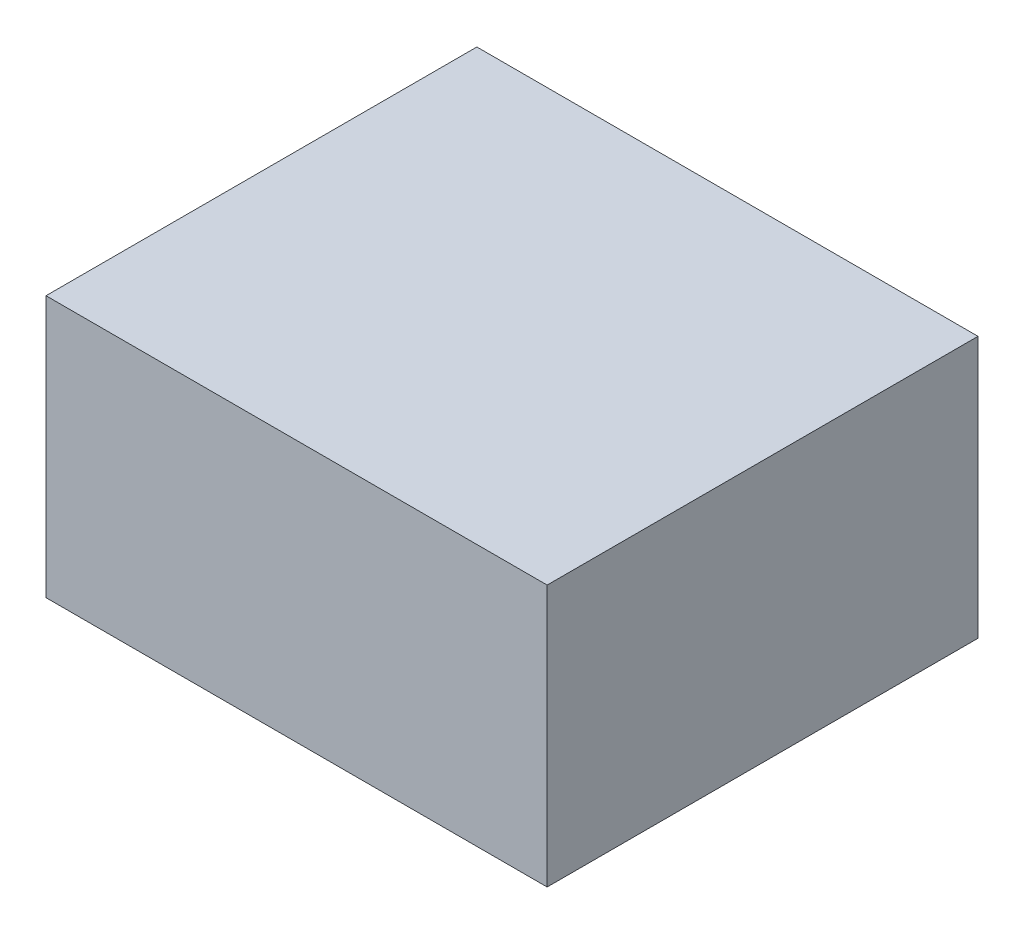
ISO-10303-21;
HEADER;
FILE_DESCRIPTION(('STEP AP214'),'2;1');
FILE_NAME('part.step','',(''),(''),'','','');
FILE_SCHEMA(('AUTOMOTIVE_DESIGN { 1 0 10303 214 1 1 1 1 }'));
ENDSEC;
DATA;
#1=APPLICATION_CONTEXT('core data for automotive mechanical design processes');
#2=APPLICATION_PROTOCOL_DEFINITION('international standard','automotive_design',2000,#1);
#3=PRODUCT_CONTEXT('',#1,'mechanical');
#4=PRODUCT('Part','Part','',(#3));
#5=PRODUCT_RELATED_PRODUCT_CATEGORY('part','',(#4));
#6=PRODUCT_DEFINITION_FORMATION('','',#4);
#7=PRODUCT_DEFINITION_CONTEXT('part definition',#1,'design');
#8=PRODUCT_DEFINITION('design','',#6,#7);
#9=PRODUCT_DEFINITION_SHAPE('','',#8);
#10=(LENGTH_UNIT() NAMED_UNIT(*) SI_UNIT(.MILLI.,.METRE.));
#11=(NAMED_UNIT(*) PLANE_ANGLE_UNIT() SI_UNIT($,.RADIAN.));
#12=(NAMED_UNIT(*) SI_UNIT($,.STERADIAN.) SOLID_ANGLE_UNIT());
#13=UNCERTAINTY_MEASURE_WITH_UNIT(LENGTH_MEASURE(1.E-05),#10,'distance_accuracy_value','');
#14=(GEOMETRIC_REPRESENTATION_CONTEXT(3) GLOBAL_UNCERTAINTY_ASSIGNED_CONTEXT((#13)) GLOBAL_UNIT_ASSIGNED_CONTEXT((#10,
#11,#12)) REPRESENTATION_CONTEXT('',''));
#15=CARTESIAN_POINT('',(0.,0.,0.));
#16=DIRECTION('',(0.,0.,1.));
#17=DIRECTION('',(1.,0.,0.));
#18=AXIS2_PLACEMENT_3D('',#15,#16,#17);
#19=CARTESIAN_POINT('',(12.2428,3.48000320000001,12.010009));
#20=DIRECTION('',(-1.,0.,0.));
#21=DIRECTION('',(0.,0.,1.));
#22=AXIS2_PLACEMENT_3D('',#19,#20,#21);
#23=PLANE('',#22);
#24=DIRECTION('',(0.,1.,0.));
#25=VECTOR('',#24,1.);
#26=CARTESIAN_POINT('',(12.2428,3.48000320000001,0.));
#27=LINE('',#26,#25);
#28=CARTESIAN_POINT('',(12.2428,-3.81,0.));
#29=VERTEX_POINT('',#28);
#30=CARTESIAN_POINT('',(12.2428,3.48000320000001,0.));
#31=VERTEX_POINT('',#30);
#32=EDGE_CURVE('E95',#29,#31,#27,.T.);
#33=ORIENTED_EDGE('',*,*,#32,.T.);
#34=DIRECTION('',(0.,0.,-1.));
#35=VECTOR('',#34,1.);
#36=CARTESIAN_POINT('',(12.2428,3.48000320000001,12.010009));
#37=LINE('',#36,#35);
#38=CARTESIAN_POINT('',(12.2428,3.48000320000001,12.010009));
#39=VERTEX_POINT('',#38);
#40=EDGE_CURVE('E11',#39,#31,#37,.T.);
#41=ORIENTED_EDGE('',*,*,#40,.F.);
#42=DIRECTION('',(0.,1.,0.));
#43=VECTOR('',#42,1.);
#44=CARTESIAN_POINT('',(12.2428,3.48000320000001,12.010009));
#45=LINE('',#44,#43);
#46=CARTESIAN_POINT('',(12.2428,-3.81,12.010009));
#47=VERTEX_POINT('',#46);
#48=EDGE_CURVE('E83',#47,#39,#45,.T.);
#49=ORIENTED_EDGE('',*,*,#48,.F.);
#50=DIRECTION('',(0.,0.,-1.));
#51=VECTOR('',#50,1.);
#52=CARTESIAN_POINT('',(12.2428,-3.81,12.010009));
#53=LINE('',#52,#51);
#54=EDGE_CURVE('E91',#47,#29,#53,.T.);
#55=ORIENTED_EDGE('',*,*,#54,.T.);
#56=EDGE_LOOP('',(#33,#41,#49,#55));
#57=FACE_BOUND('',#56,.T.);
#58=ADVANCED_FACE('F32',(#57),#23,.F.);
#59=CARTESIAN_POINT('',(-1.7272,3.48000320000001,12.010009));
#60=DIRECTION('',(0.,-1.,0.));
#61=DIRECTION('',(0.,0.,-1.));
#62=AXIS2_PLACEMENT_3D('',#59,#60,#61);
#63=PLANE('',#62);
#64=DIRECTION('',(-1.,0.,0.));
#65=VECTOR('',#64,1.);
#66=CARTESIAN_POINT('',(-1.7272,3.48000320000001,0.));
#67=LINE('',#66,#65);
#68=CARTESIAN_POINT('',(-1.7272,3.48000320000001,0.));
#69=VERTEX_POINT('',#68);
#70=EDGE_CURVE('E87',#31,#69,#67,.T.);
#71=ORIENTED_EDGE('',*,*,#70,.T.);
#72=DIRECTION('',(0.,0.,-1.));
#73=VECTOR('',#72,1.);
#74=CARTESIAN_POINT('',(-1.7272,3.48000320000001,12.010009));
#75=LINE('',#74,#73);
#76=CARTESIAN_POINT('',(-1.7272,3.48000320000001,12.010009));
#77=VERTEX_POINT('',#76);
#78=EDGE_CURVE('E40',#77,#69,#75,.T.);
#79=ORIENTED_EDGE('',*,*,#78,.F.);
#80=DIRECTION('',(-1.,0.,0.));
#81=VECTOR('',#80,1.);
#82=CARTESIAN_POINT('',(-1.7272,3.48000320000001,12.010009));
#83=LINE('',#82,#81);
#84=EDGE_CURVE('E78',#39,#77,#83,.T.);
#85=ORIENTED_EDGE('',*,*,#84,.F.);
#86=ORIENTED_EDGE('',*,*,#40,.T.);
#87=EDGE_LOOP('',(#71,#79,#85,#86));
#88=FACE_BOUND('',#87,.T.);
#89=ADVANCED_FACE('F86',(#88),#63,.F.);
#90=CARTESIAN_POINT('',(-1.7272,-3.81,12.010009));
#91=DIRECTION('',(1.,0.,0.));
#92=DIRECTION('',(0.,0.,-1.));
#93=AXIS2_PLACEMENT_3D('',#90,#91,#92);
#94=PLANE('',#93);
#95=DIRECTION('',(0.,-1.,0.));
#96=VECTOR('',#95,1.);
#97=CARTESIAN_POINT('',(-1.7272,-3.81,0.));
#98=LINE('',#97,#96);
#99=CARTESIAN_POINT('',(-1.7272,-3.81,0.));
#100=VERTEX_POINT('',#99);
#101=EDGE_CURVE('E65',#69,#100,#98,.T.);
#102=ORIENTED_EDGE('',*,*,#101,.T.);
#103=DIRECTION('',(0.,0.,-1.));
#104=VECTOR('',#103,1.);
#105=CARTESIAN_POINT('',(-1.7272,-3.81,12.010009));
#106=LINE('',#105,#104);
#107=CARTESIAN_POINT('',(-1.7272,-3.81,12.010009));
#108=VERTEX_POINT('',#107);
#109=EDGE_CURVE('E88',#108,#100,#106,.T.);
#110=ORIENTED_EDGE('',*,*,#109,.F.);
#111=DIRECTION('',(0.,-1.,0.));
#112=VECTOR('',#111,1.);
#113=CARTESIAN_POINT('',(-1.7272,-3.81,12.010009));
#114=LINE('',#113,#112);
#115=EDGE_CURVE('E81',#77,#108,#114,.T.);
#116=ORIENTED_EDGE('',*,*,#115,.F.);
#117=ORIENTED_EDGE('',*,*,#78,.T.);
#118=EDGE_LOOP('',(#102,#110,#116,#117));
#119=FACE_BOUND('',#118,.T.);
#120=ADVANCED_FACE('F89',(#119),#94,.F.);
#121=CARTESIAN_POINT('',(12.2428,-3.81,12.010009));
#122=DIRECTION('',(0.,1.,0.));
#123=DIRECTION('',(0.,0.,1.));
#124=AXIS2_PLACEMENT_3D('',#121,#122,#123);
#125=PLANE('',#124);
#126=DIRECTION('',(1.,0.,0.));
#127=VECTOR('',#126,1.);
#128=CARTESIAN_POINT('',(12.2428,-3.81,0.));
#129=LINE('',#128,#127);
#130=EDGE_CURVE('E71',#100,#29,#129,.T.);
#131=ORIENTED_EDGE('',*,*,#130,.T.);
#132=ORIENTED_EDGE('',*,*,#54,.F.);
#133=DIRECTION('',(1.,0.,0.));
#134=VECTOR('',#133,1.);
#135=CARTESIAN_POINT('',(12.2428,-3.81,12.010009));
#136=LINE('',#135,#134);
#137=EDGE_CURVE('E48',#108,#47,#136,.T.);
#138=ORIENTED_EDGE('',*,*,#137,.F.);
#139=ORIENTED_EDGE('',*,*,#109,.T.);
#140=EDGE_LOOP('',(#131,#132,#138,#139));
#141=FACE_BOUND('',#140,.T.);
#142=ADVANCED_FACE('F102',(#141),#125,.F.);
#143=CARTESIAN_POINT('',(0.,0.,12.010009));
#144=DIRECTION('',(0.,0.,-1.));
#145=DIRECTION('',(-1.,0.,0.));
#146=AXIS2_PLACEMENT_3D('',#143,#144,#145);
#147=PLANE('',#146);
#148=ORIENTED_EDGE('',*,*,#48,.T.);
#149=ORIENTED_EDGE('',*,*,#84,.T.);
#150=ORIENTED_EDGE('',*,*,#115,.T.);
#151=ORIENTED_EDGE('',*,*,#137,.T.);
#152=EDGE_LOOP('',(#148,#149,#150,#151));
#153=FACE_BOUND('',#152,.T.);
#154=ADVANCED_FACE('F79',(#153),#147,.F.);
#155=CARTESIAN_POINT('',(0.,0.,0.));
#156=DIRECTION('',(0.,0.,-1.));
#157=DIRECTION('',(-1.,0.,0.));
#158=AXIS2_PLACEMENT_3D('',#155,#156,#157);
#159=PLANE('',#158);
#160=ORIENTED_EDGE('',*,*,#32,.F.);
#161=ORIENTED_EDGE('',*,*,#130,.F.);
#162=ORIENTED_EDGE('',*,*,#101,.F.);
#163=ORIENTED_EDGE('',*,*,#70,.F.);
#164=EDGE_LOOP('',(#160,#161,#162,#163));
#165=FACE_BOUND('',#164,.T.);
#166=ADVANCED_FACE('F105',(#165),#159,.T.);
#167=CLOSED_SHELL('',(#58,#89,#120,#142,#154,#166));
#168=MANIFOLD_SOLID_BREP('B2',#167);
#169=ADVANCED_BREP_SHAPE_REPRESENTATION('',(#18,#168),#14);
#170=SHAPE_DEFINITION_REPRESENTATION(#9,#169);
ENDSEC;
END-ISO-10303-21;
